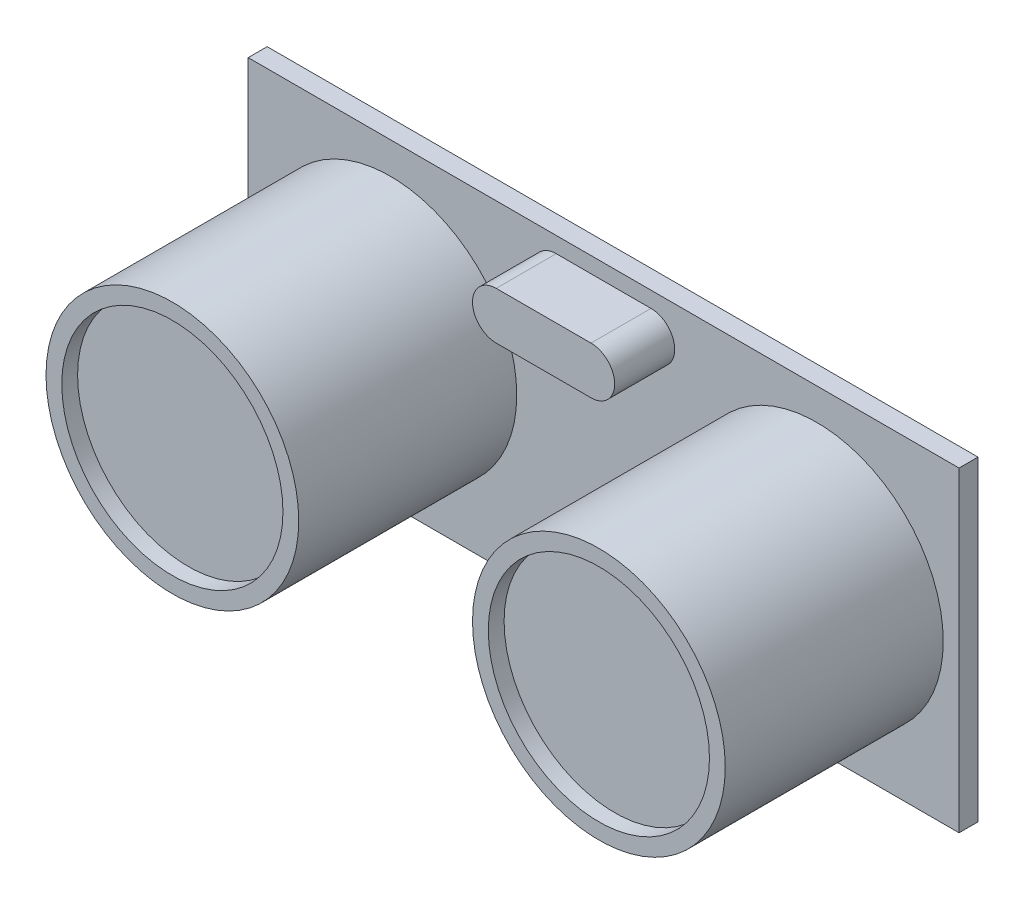
ISO-10303-21;
HEADER;
FILE_DESCRIPTION(('STEP AP214'),'2;1');
FILE_NAME('part.step','',(''),(''),'','','');
FILE_SCHEMA(('AUTOMOTIVE_DESIGN { 1 0 10303 214 1 1 1 1 }'));
ENDSEC;
DATA;
#1=APPLICATION_CONTEXT('core data for automotive mechanical design processes');
#2=APPLICATION_PROTOCOL_DEFINITION('international standard','automotive_design',2000,#1);
#3=PRODUCT_CONTEXT('',#1,'mechanical');
#4=PRODUCT('Part','Part','',(#3));
#5=PRODUCT_RELATED_PRODUCT_CATEGORY('part','',(#4));
#6=PRODUCT_DEFINITION_FORMATION('','',#4);
#7=PRODUCT_DEFINITION_CONTEXT('part definition',#1,'design');
#8=PRODUCT_DEFINITION('design','',#6,#7);
#9=PRODUCT_DEFINITION_SHAPE('','',#8);
#10=(LENGTH_UNIT() NAMED_UNIT(*) SI_UNIT(.MILLI.,.METRE.));
#11=(NAMED_UNIT(*) PLANE_ANGLE_UNIT() SI_UNIT($,.RADIAN.));
#12=(NAMED_UNIT(*) SI_UNIT($,.STERADIAN.) SOLID_ANGLE_UNIT());
#13=UNCERTAINTY_MEASURE_WITH_UNIT(LENGTH_MEASURE(1.E-05),#10,'distance_accuracy_value','');
#14=(GEOMETRIC_REPRESENTATION_CONTEXT(3) GLOBAL_UNCERTAINTY_ASSIGNED_CONTEXT((#13)) GLOBAL_UNIT_ASSIGNED_CONTEXT((#10,
#11,#12)) REPRESENTATION_CONTEXT('',''));
#15=CARTESIAN_POINT('',(0.,0.,0.));
#16=DIRECTION('',(0.,0.,1.));
#17=DIRECTION('',(1.,0.,0.));
#18=AXIS2_PLACEMENT_3D('',#15,#16,#17);
#19=CARTESIAN_POINT('',(0.,0.,1.2));
#20=DIRECTION('',(0.,0.,-1.));
#21=DIRECTION('',(-1.,0.,0.));
#22=AXIS2_PLACEMENT_3D('',#19,#20,#21);
#23=PLANE('',#22);
#24=DIRECTION('',(0.,1.,0.));
#25=VECTOR('',#24,1.);
#26=CARTESIAN_POINT('',(22.5,-10.,1.2));
#27=LINE('',#26,#25);
#28=CARTESIAN_POINT('',(22.5,-10.,1.2));
#29=VERTEX_POINT('',#28);
#30=CARTESIAN_POINT('',(22.5,10.,1.2));
#31=VERTEX_POINT('',#30);
#32=EDGE_CURVE('E146',#29,#31,#27,.T.);
#33=ORIENTED_EDGE('',*,*,#32,.T.);
#34=DIRECTION('',(-1.,0.,0.));
#35=VECTOR('',#34,1.);
#36=CARTESIAN_POINT('',(-22.5,10.,1.2));
#37=LINE('',#36,#35);
#38=CARTESIAN_POINT('',(-22.5,10.,1.2));
#39=VERTEX_POINT('',#38);
#40=EDGE_CURVE('E149',#31,#39,#37,.T.);
#41=ORIENTED_EDGE('',*,*,#40,.T.);
#42=DIRECTION('',(0.,-1.,0.));
#43=VECTOR('',#42,1.);
#44=CARTESIAN_POINT('',(-22.5,-10.,1.2));
#45=LINE('',#44,#43);
#46=CARTESIAN_POINT('',(-22.5,-10.,1.2));
#47=VERTEX_POINT('',#46);
#48=EDGE_CURVE('E152',#39,#47,#45,.T.);
#49=ORIENTED_EDGE('',*,*,#48,.T.);
#50=DIRECTION('',(1.,0.,0.));
#51=VECTOR('',#50,1.);
#52=CARTESIAN_POINT('',(-22.5,-10.,1.2));
#53=LINE('',#52,#51);
#54=EDGE_CURVE('E154',#47,#29,#53,.T.);
#55=ORIENTED_EDGE('',*,*,#54,.T.);
#56=EDGE_LOOP('',(#33,#41,#49,#55));
#57=FACE_BOUND('',#56,.T.);
#58=CARTESIAN_POINT('',(-13.5,0.,1.2));
#59=DIRECTION('',(0.,0.,-1.));
#60=DIRECTION('',(-1.,0.,0.));
#61=AXIS2_PLACEMENT_3D('',#58,#59,#60);
#62=CIRCLE('',#61,8.);
#63=CARTESIAN_POINT('',(-21.5,0.,1.2));
#64=VERTEX_POINT('',#63);
#65=EDGE_CURVE('E47',#64,#64,#62,.F.);
#66=ORIENTED_EDGE('',*,*,#65,.F.);
#67=EDGE_LOOP('',(#66));
#68=FACE_BOUND('',#67,.T.);
#69=CARTESIAN_POINT('',(13.5,0.,1.2));
#70=DIRECTION('',(0.,0.,-1.));
#71=DIRECTION('',(-1.,0.,0.));
#72=AXIS2_PLACEMENT_3D('',#69,#70,#71);
#73=CIRCLE('',#72,8.);
#74=CARTESIAN_POINT('',(5.5,0.,1.2));
#75=VERTEX_POINT('',#74);
#76=EDGE_CURVE('E11',#75,#75,#73,.F.);
#77=ORIENTED_EDGE('',*,*,#76,.F.);
#78=EDGE_LOOP('',(#77));
#79=FACE_BOUND('',#78,.T.);
#80=CARTESIAN_POINT('',(-3.,7.5,1.2));
#81=DIRECTION('',(0.,0.,-1.));
#82=DIRECTION('',(-1.,0.,0.));
#83=AXIS2_PLACEMENT_3D('',#80,#81,#82);
#84=CIRCLE('',#83,1.5);
#85=CARTESIAN_POINT('',(-3.,9.,1.2));
#86=VERTEX_POINT('',#85);
#87=CARTESIAN_POINT('',(-3.,6.,1.2));
#88=VERTEX_POINT('',#87);
#89=EDGE_CURVE('E125',#86,#88,#84,.F.);
#90=ORIENTED_EDGE('',*,*,#89,.F.);
#91=DIRECTION('',(-1.,0.,0.));
#92=VECTOR('',#91,1.);
#93=CARTESIAN_POINT('',(0.,9.,1.2));
#94=LINE('',#93,#92);
#95=CARTESIAN_POINT('',(3.,9.,1.2));
#96=VERTEX_POINT('',#95);
#97=EDGE_CURVE('E126',#96,#86,#94,.T.);
#98=ORIENTED_EDGE('',*,*,#97,.F.);
#99=CARTESIAN_POINT('',(3.,7.5,1.2));
#100=DIRECTION('',(0.,0.,-1.));
#101=DIRECTION('',(-1.,0.,0.));
#102=AXIS2_PLACEMENT_3D('',#99,#100,#101);
#103=CIRCLE('',#102,1.5);
#104=CARTESIAN_POINT('',(3.,6.,1.2));
#105=VERTEX_POINT('',#104);
#106=EDGE_CURVE('E60',#105,#96,#103,.F.);
#107=ORIENTED_EDGE('',*,*,#106,.F.);
#108=DIRECTION('',(1.,0.,0.));
#109=VECTOR('',#108,1.);
#110=CARTESIAN_POINT('',(0.,6.,1.2));
#111=LINE('',#110,#109);
#112=EDGE_CURVE('E55',#88,#105,#111,.T.);
#113=ORIENTED_EDGE('',*,*,#112,.F.);
#114=EDGE_LOOP('',(#90,#98,#107,#113));
#115=FACE_BOUND('',#114,.T.);
#116=ADVANCED_FACE('F38',(#57,#68,#79,#115),#23,.F.);
#117=CARTESIAN_POINT('',(22.5,-10.,1.2));
#118=DIRECTION('',(-1.,0.,0.));
#119=DIRECTION('',(0.,0.,1.));
#120=AXIS2_PLACEMENT_3D('',#117,#118,#119);
#121=PLANE('',#120);
#122=DIRECTION('',(0.,1.,0.));
#123=VECTOR('',#122,1.);
#124=CARTESIAN_POINT('',(22.5,-10.,0.));
#125=LINE('',#124,#123);
#126=CARTESIAN_POINT('',(22.5,-10.,0.));
#127=VERTEX_POINT('',#126);
#128=CARTESIAN_POINT('',(22.5,10.,0.));
#129=VERTEX_POINT('',#128);
#130=EDGE_CURVE('E143',#127,#129,#125,.T.);
#131=ORIENTED_EDGE('',*,*,#130,.T.);
#132=DIRECTION('',(0.,0.,-1.));
#133=VECTOR('',#132,1.);
#134=CARTESIAN_POINT('',(22.5,10.,1.2));
#135=LINE('',#134,#133);
#136=EDGE_CURVE('E42',#31,#129,#135,.T.);
#137=ORIENTED_EDGE('',*,*,#136,.F.);
#138=ORIENTED_EDGE('',*,*,#32,.F.);
#139=DIRECTION('',(0.,0.,-1.));
#140=VECTOR('',#139,1.);
#141=CARTESIAN_POINT('',(22.5,-10.,1.2));
#142=LINE('',#141,#140);
#143=EDGE_CURVE('E156',#29,#127,#142,.T.);
#144=ORIENTED_EDGE('',*,*,#143,.T.);
#145=EDGE_LOOP('',(#131,#137,#138,#144));
#146=FACE_BOUND('',#145,.T.);
#147=ADVANCED_FACE('F40',(#146),#121,.F.);
#148=CARTESIAN_POINT('',(-22.5,10.,1.2));
#149=DIRECTION('',(0.,-1.,0.));
#150=DIRECTION('',(0.,0.,-1.));
#151=AXIS2_PLACEMENT_3D('',#148,#149,#150);
#152=PLANE('',#151);
#153=DIRECTION('',(-1.,0.,0.));
#154=VECTOR('',#153,1.);
#155=CARTESIAN_POINT('',(-22.5,10.,0.));
#156=LINE('',#155,#154);
#157=CARTESIAN_POINT('',(-22.5,10.,0.));
#158=VERTEX_POINT('',#157);
#159=EDGE_CURVE('E159',#129,#158,#156,.T.);
#160=ORIENTED_EDGE('',*,*,#159,.T.);
#161=DIRECTION('',(0.,0.,-1.));
#162=VECTOR('',#161,1.);
#163=CARTESIAN_POINT('',(-22.5,10.,1.2));
#164=LINE('',#163,#162);
#165=EDGE_CURVE('E168',#39,#158,#164,.T.);
#166=ORIENTED_EDGE('',*,*,#165,.F.);
#167=ORIENTED_EDGE('',*,*,#40,.F.);
#168=ORIENTED_EDGE('',*,*,#136,.T.);
#169=EDGE_LOOP('',(#160,#166,#167,#168));
#170=FACE_BOUND('',#169,.T.);
#171=ADVANCED_FACE('F177',(#170),#152,.F.);
#172=CARTESIAN_POINT('',(-22.5,-10.,1.2));
#173=DIRECTION('',(1.,0.,0.));
#174=DIRECTION('',(0.,0.,-1.));
#175=AXIS2_PLACEMENT_3D('',#172,#173,#174);
#176=PLANE('',#175);
#177=DIRECTION('',(0.,-1.,0.));
#178=VECTOR('',#177,1.);
#179=CARTESIAN_POINT('',(-22.5,-10.,0.));
#180=LINE('',#179,#178);
#181=CARTESIAN_POINT('',(-22.5,-10.,0.));
#182=VERTEX_POINT('',#181);
#183=EDGE_CURVE('E161',#158,#182,#180,.T.);
#184=ORIENTED_EDGE('',*,*,#183,.T.);
#185=DIRECTION('',(0.,0.,-1.));
#186=VECTOR('',#185,1.);
#187=CARTESIAN_POINT('',(-22.5,-10.,1.2));
#188=LINE('',#187,#186);
#189=EDGE_CURVE('E166',#47,#182,#188,.T.);
#190=ORIENTED_EDGE('',*,*,#189,.F.);
#191=ORIENTED_EDGE('',*,*,#48,.F.);
#192=ORIENTED_EDGE('',*,*,#165,.T.);
#193=EDGE_LOOP('',(#184,#190,#191,#192));
#194=FACE_BOUND('',#193,.T.);
#195=ADVANCED_FACE('F186',(#194),#176,.F.);
#196=CARTESIAN_POINT('',(-22.5,-10.,1.2));
#197=DIRECTION('',(0.,1.,0.));
#198=DIRECTION('',(0.,0.,1.));
#199=AXIS2_PLACEMENT_3D('',#196,#197,#198);
#200=PLANE('',#199);
#201=DIRECTION('',(1.,0.,0.));
#202=VECTOR('',#201,1.);
#203=CARTESIAN_POINT('',(-22.5,-10.,0.));
#204=LINE('',#203,#202);
#205=EDGE_CURVE('E150',#182,#127,#204,.T.);
#206=ORIENTED_EDGE('',*,*,#205,.T.);
#207=ORIENTED_EDGE('',*,*,#143,.F.);
#208=ORIENTED_EDGE('',*,*,#54,.F.);
#209=ORIENTED_EDGE('',*,*,#189,.T.);
#210=EDGE_LOOP('',(#206,#207,#208,#209));
#211=FACE_BOUND('',#210,.T.);
#212=ADVANCED_FACE('F189',(#211),#200,.F.);
#213=CARTESIAN_POINT('',(0.,0.,0.));
#214=DIRECTION('',(0.,0.,-1.));
#215=DIRECTION('',(-1.,0.,0.));
#216=AXIS2_PLACEMENT_3D('',#213,#214,#215);
#217=PLANE('',#216);
#218=ORIENTED_EDGE('',*,*,#130,.F.);
#219=ORIENTED_EDGE('',*,*,#205,.F.);
#220=ORIENTED_EDGE('',*,*,#183,.F.);
#221=ORIENTED_EDGE('',*,*,#159,.F.);
#222=EDGE_LOOP('',(#218,#219,#220,#221));
#223=FACE_BOUND('',#222,.T.);
#224=ADVANCED_FACE('F184',(#223),#217,.T.);
#225=CARTESIAN_POINT('',(-13.5,0.,15.));
#226=DIRECTION('',(0.,0.,-1.));
#227=DIRECTION('',(-1.,0.,0.));
#228=AXIS2_PLACEMENT_3D('',#225,#226,#227);
#229=CYLINDRICAL_SURFACE('',#228,8.);
#230=CARTESIAN_POINT('',(-13.5,0.,15.));
#231=DIRECTION('',(0.,0.,1.));
#232=DIRECTION('',(1.,0.,0.));
#233=AXIS2_PLACEMENT_3D('',#230,#231,#232);
#234=CIRCLE('',#233,8.);
#235=CARTESIAN_POINT('',(-5.5,0.,15.));
#236=VERTEX_POINT('',#235);
#237=EDGE_CURVE('E139',#236,#236,#234,.T.);
#238=ORIENTED_EDGE('',*,*,#237,.F.);
#239=EDGE_LOOP('',(#238));
#240=FACE_BOUND('',#239,.T.);
#241=ORIENTED_EDGE('',*,*,#65,.T.);
#242=EDGE_LOOP('',(#241));
#243=FACE_BOUND('',#242,.T.);
#244=ADVANCED_FACE('F231',(#240,#243),#229,.T.);
#245=CARTESIAN_POINT('',(-13.5,0.,15.));
#246=DIRECTION('',(0.,0.,1.));
#247=DIRECTION('',(1.,0.,0.));
#248=AXIS2_PLACEMENT_3D('',#245,#246,#247);
#249=PLANE('',#248);
#250=CARTESIAN_POINT('',(-13.5,0.,15.));
#251=DIRECTION('',(0.,0.,1.));
#252=DIRECTION('',(1.,0.,0.));
#253=AXIS2_PLACEMENT_3D('',#250,#251,#252);
#254=CIRCLE('',#253,7.);
#255=CARTESIAN_POINT('',(-6.5,0.,15.));
#256=VERTEX_POINT('',#255);
#257=EDGE_CURVE('E212',#256,#256,#254,.T.);
#258=ORIENTED_EDGE('',*,*,#257,.F.);
#259=EDGE_LOOP('',(#258));
#260=FACE_BOUND('',#259,.T.);
#261=ORIENTED_EDGE('',*,*,#237,.T.);
#262=EDGE_LOOP('',(#261));
#263=FACE_BOUND('',#262,.T.);
#264=ADVANCED_FACE('F227',(#260,#263),#249,.T.);
#265=CARTESIAN_POINT('',(13.5,0.,15.));
#266=DIRECTION('',(0.,0.,-1.));
#267=DIRECTION('',(-1.,0.,0.));
#268=AXIS2_PLACEMENT_3D('',#265,#266,#267);
#269=CYLINDRICAL_SURFACE('',#268,8.);
#270=CARTESIAN_POINT('',(13.5,0.,15.));
#271=DIRECTION('',(0.,0.,1.));
#272=DIRECTION('',(1.,0.,0.));
#273=AXIS2_PLACEMENT_3D('',#270,#271,#272);
#274=CIRCLE('',#273,8.);
#275=CARTESIAN_POINT('',(21.5,0.,15.));
#276=VERTEX_POINT('',#275);
#277=EDGE_CURVE('E137',#276,#276,#274,.T.);
#278=ORIENTED_EDGE('',*,*,#277,.F.);
#279=EDGE_LOOP('',(#278));
#280=FACE_BOUND('',#279,.T.);
#281=ORIENTED_EDGE('',*,*,#76,.T.);
#282=EDGE_LOOP('',(#281));
#283=FACE_BOUND('',#282,.T.);
#284=ADVANCED_FACE('F230',(#280,#283),#269,.T.);
#285=CARTESIAN_POINT('',(13.5,0.,15.));
#286=DIRECTION('',(0.,0.,1.));
#287=DIRECTION('',(1.,0.,0.));
#288=AXIS2_PLACEMENT_3D('',#285,#286,#287);
#289=PLANE('',#288);
#290=CARTESIAN_POINT('',(13.5,0.,15.));
#291=DIRECTION('',(0.,0.,1.));
#292=DIRECTION('',(1.,0.,0.));
#293=AXIS2_PLACEMENT_3D('',#290,#291,#292);
#294=CIRCLE('',#293,7.00000000000001);
#295=CARTESIAN_POINT('',(20.5,0.,15.));
#296=VERTEX_POINT('',#295);
#297=EDGE_CURVE('E206',#296,#296,#294,.T.);
#298=ORIENTED_EDGE('',*,*,#297,.F.);
#299=EDGE_LOOP('',(#298));
#300=FACE_BOUND('',#299,.T.);
#301=ORIENTED_EDGE('',*,*,#277,.T.);
#302=EDGE_LOOP('',(#301));
#303=FACE_BOUND('',#302,.T.);
#304=ADVANCED_FACE('F279',(#300,#303),#289,.T.);
#305=CARTESIAN_POINT('',(-3.,7.5,5.));
#306=DIRECTION('',(0.,0.,-1.));
#307=DIRECTION('',(-1.,0.,0.));
#308=AXIS2_PLACEMENT_3D('',#305,#306,#307);
#309=CYLINDRICAL_SURFACE('',#308,1.5);
#310=DIRECTION('',(0.,0.,-1.));
#311=VECTOR('',#310,1.);
#312=CARTESIAN_POINT('',(-3.,9.,5.));
#313=LINE('',#312,#311);
#314=CARTESIAN_POINT('',(-3.,9.,5.));
#315=VERTEX_POINT('',#314);
#316=EDGE_CURVE('E200',#315,#86,#313,.T.);
#317=ORIENTED_EDGE('',*,*,#316,.T.);
#318=ORIENTED_EDGE('',*,*,#89,.T.);
#319=DIRECTION('',(0.,0.,-1.));
#320=VECTOR('',#319,1.);
#321=CARTESIAN_POINT('',(-3.,6.,5.));
#322=LINE('',#321,#320);
#323=CARTESIAN_POINT('',(-3.,6.,5.));
#324=VERTEX_POINT('',#323);
#325=EDGE_CURVE('E107',#324,#88,#322,.T.);
#326=ORIENTED_EDGE('',*,*,#325,.F.);
#327=CARTESIAN_POINT('',(-3.,7.5,5.));
#328=DIRECTION('',(0.,0.,1.));
#329=DIRECTION('',(1.,0.,0.));
#330=AXIS2_PLACEMENT_3D('',#327,#328,#329);
#331=CIRCLE('',#330,1.5);
#332=EDGE_CURVE('E113',#315,#324,#331,.T.);
#333=ORIENTED_EDGE('',*,*,#332,.F.);
#334=EDGE_LOOP('',(#317,#318,#326,#333));
#335=FACE_BOUND('',#334,.T.);
#336=ADVANCED_FACE('F124',(#335),#309,.T.);
#337=CARTESIAN_POINT('',(-3.,6.,5.));
#338=DIRECTION('',(0.,1.,0.));
#339=DIRECTION('',(0.,0.,1.));
#340=AXIS2_PLACEMENT_3D('',#337,#338,#339);
#341=PLANE('',#340);
#342=ORIENTED_EDGE('',*,*,#325,.T.);
#343=ORIENTED_EDGE('',*,*,#112,.T.);
#344=DIRECTION('',(0.,0.,-1.));
#345=VECTOR('',#344,1.);
#346=CARTESIAN_POINT('',(3.,6.,5.));
#347=LINE('',#346,#345);
#348=CARTESIAN_POINT('',(3.,6.,5.));
#349=VERTEX_POINT('',#348);
#350=EDGE_CURVE('E109',#349,#105,#347,.T.);
#351=ORIENTED_EDGE('',*,*,#350,.F.);
#352=DIRECTION('',(1.,0.,0.));
#353=VECTOR('',#352,1.);
#354=CARTESIAN_POINT('',(-3.,6.,5.));
#355=LINE('',#354,#353);
#356=EDGE_CURVE('E103',#324,#349,#355,.T.);
#357=ORIENTED_EDGE('',*,*,#356,.F.);
#358=EDGE_LOOP('',(#342,#343,#351,#357));
#359=FACE_BOUND('',#358,.T.);
#360=ADVANCED_FACE('F105',(#359),#341,.F.);
#361=CARTESIAN_POINT('',(3.,7.5,5.));
#362=DIRECTION('',(0.,0.,-1.));
#363=DIRECTION('',(-1.,0.,0.));
#364=AXIS2_PLACEMENT_3D('',#361,#362,#363);
#365=CYLINDRICAL_SURFACE('',#364,1.5);
#366=ORIENTED_EDGE('',*,*,#350,.T.);
#367=ORIENTED_EDGE('',*,*,#106,.T.);
#368=DIRECTION('',(0.,0.,-1.));
#369=VECTOR('',#368,1.);
#370=CARTESIAN_POINT('',(3.,9.,5.));
#371=LINE('',#370,#369);
#372=CARTESIAN_POINT('',(3.,9.,5.));
#373=VERTEX_POINT('',#372);
#374=EDGE_CURVE('E130',#373,#96,#371,.T.);
#375=ORIENTED_EDGE('',*,*,#374,.F.);
#376=CARTESIAN_POINT('',(3.,7.5,5.));
#377=DIRECTION('',(0.,0.,1.));
#378=DIRECTION('',(1.,0.,0.));
#379=AXIS2_PLACEMENT_3D('',#376,#377,#378);
#380=CIRCLE('',#379,1.5);
#381=EDGE_CURVE('E112',#349,#373,#380,.T.);
#382=ORIENTED_EDGE('',*,*,#381,.F.);
#383=EDGE_LOOP('',(#366,#367,#375,#382));
#384=FACE_BOUND('',#383,.T.);
#385=ADVANCED_FACE('F289',(#384),#365,.T.);
#386=CARTESIAN_POINT('',(-3.,9.,5.));
#387=DIRECTION('',(0.,-1.,0.));
#388=DIRECTION('',(0.,0.,-1.));
#389=AXIS2_PLACEMENT_3D('',#386,#387,#388);
#390=PLANE('',#389);
#391=ORIENTED_EDGE('',*,*,#374,.T.);
#392=ORIENTED_EDGE('',*,*,#97,.T.);
#393=ORIENTED_EDGE('',*,*,#316,.F.);
#394=DIRECTION('',(-1.,0.,0.));
#395=VECTOR('',#394,1.);
#396=CARTESIAN_POINT('',(-3.,9.,5.));
#397=LINE('',#396,#395);
#398=EDGE_CURVE('E118',#373,#315,#397,.T.);
#399=ORIENTED_EDGE('',*,*,#398,.F.);
#400=EDGE_LOOP('',(#391,#392,#393,#399));
#401=FACE_BOUND('',#400,.T.);
#402=ADVANCED_FACE('F199',(#401),#390,.F.);
#403=CARTESIAN_POINT('',(-3.,7.5,5.));
#404=DIRECTION('',(0.,0.,1.));
#405=DIRECTION('',(1.,0.,0.));
#406=AXIS2_PLACEMENT_3D('',#403,#404,#405);
#407=PLANE('',#406);
#408=ORIENTED_EDGE('',*,*,#332,.T.);
#409=ORIENTED_EDGE('',*,*,#356,.T.);
#410=ORIENTED_EDGE('',*,*,#381,.T.);
#411=ORIENTED_EDGE('',*,*,#398,.T.);
#412=EDGE_LOOP('',(#408,#409,#410,#411));
#413=FACE_BOUND('',#412,.T.);
#414=ADVANCED_FACE('F116',(#413),#407,.T.);
#415=CARTESIAN_POINT('',(13.5,0.,14.));
#416=DIRECTION('',(0.,0.,1.));
#417=DIRECTION('',(1.,0.,0.));
#418=AXIS2_PLACEMENT_3D('',#415,#416,#417);
#419=CYLINDRICAL_SURFACE('',#418,7.00000000000001);
#420=CARTESIAN_POINT('',(13.5,0.,14.));
#421=DIRECTION('',(0.,0.,1.));
#422=DIRECTION('',(1.,0.,0.));
#423=AXIS2_PLACEMENT_3D('',#420,#421,#422);
#424=CIRCLE('',#423,7.00000000000001);
#425=CARTESIAN_POINT('',(20.5,0.,14.));
#426=VERTEX_POINT('',#425);
#427=EDGE_CURVE('E209',#426,#426,#424,.T.);
#428=ORIENTED_EDGE('',*,*,#427,.F.);
#429=EDGE_LOOP('',(#428));
#430=FACE_BOUND('',#429,.T.);
#431=ORIENTED_EDGE('',*,*,#297,.T.);
#432=EDGE_LOOP('',(#431));
#433=FACE_BOUND('',#432,.T.);
#434=ADVANCED_FACE('F315',(#430,#433),#419,.F.);
#435=CARTESIAN_POINT('',(13.5,0.,14.));
#436=DIRECTION('',(0.,0.,1.));
#437=DIRECTION('',(1.,0.,0.));
#438=AXIS2_PLACEMENT_3D('',#435,#436,#437);
#439=PLANE('',#438);
#440=ORIENTED_EDGE('',*,*,#427,.T.);
#441=EDGE_LOOP('',(#440));
#442=FACE_BOUND('',#441,.T.);
#443=ADVANCED_FACE('F223',(#442),#439,.T.);
#444=CARTESIAN_POINT('',(-13.5,0.,14.));
#445=DIRECTION('',(0.,0.,1.));
#446=DIRECTION('',(1.,0.,0.));
#447=AXIS2_PLACEMENT_3D('',#444,#445,#446);
#448=CYLINDRICAL_SURFACE('',#447,7.);
#449=CARTESIAN_POINT('',(-13.5,0.,14.));
#450=DIRECTION('',(0.,0.,1.));
#451=DIRECTION('',(1.,0.,0.));
#452=AXIS2_PLACEMENT_3D('',#449,#450,#451);
#453=CIRCLE('',#452,7.);
#454=CARTESIAN_POINT('',(-6.5,0.,14.));
#455=VERTEX_POINT('',#454);
#456=EDGE_CURVE('E122',#455,#455,#453,.T.);
#457=ORIENTED_EDGE('',*,*,#456,.F.);
#458=EDGE_LOOP('',(#457));
#459=FACE_BOUND('',#458,.T.);
#460=ORIENTED_EDGE('',*,*,#257,.T.);
#461=EDGE_LOOP('',(#460));
#462=FACE_BOUND('',#461,.T.);
#463=ADVANCED_FACE('F220',(#459,#462),#448,.F.);
#464=CARTESIAN_POINT('',(-13.5,0.,14.));
#465=DIRECTION('',(0.,0.,1.));
#466=DIRECTION('',(1.,0.,0.));
#467=AXIS2_PLACEMENT_3D('',#464,#465,#466);
#468=PLANE('',#467);
#469=ORIENTED_EDGE('',*,*,#456,.T.);
#470=EDGE_LOOP('',(#469));
#471=FACE_BOUND('',#470,.T.);
#472=ADVANCED_FACE('F218',(#471),#468,.T.);
#473=CLOSED_SHELL('',(#116,#147,#171,#195,#212,#224,#244,#264,#284,#304,#336,#360,#385,#402,
#414,#434,#443,#463,#472));
#474=MANIFOLD_SOLID_BREP('B2',#473);
#475=ADVANCED_BREP_SHAPE_REPRESENTATION('',(#18,#474),#14);
#476=SHAPE_DEFINITION_REPRESENTATION(#9,#475);
ENDSEC;
END-ISO-10303-21;
